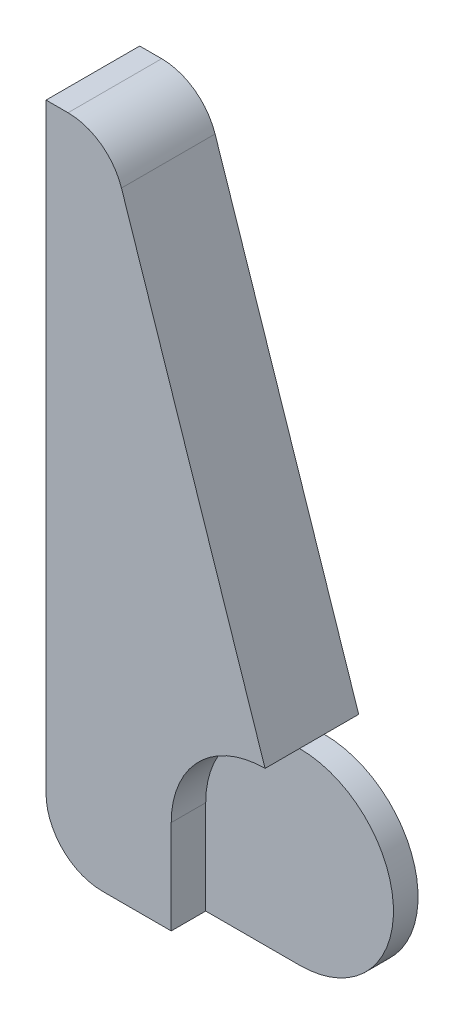
ISO-10303-21;
HEADER;
FILE_DESCRIPTION(('STEP AP214'),'2;1');
FILE_NAME('part.step','',(''),(''),'','','');
FILE_SCHEMA(('AUTOMOTIVE_DESIGN { 1 0 10303 214 1 1 1 1 }'));
ENDSEC;
DATA;
#1=APPLICATION_CONTEXT('core data for automotive mechanical design processes');
#2=APPLICATION_PROTOCOL_DEFINITION('international standard','automotive_design',2000,#1);
#3=PRODUCT_CONTEXT('',#1,'mechanical');
#4=PRODUCT('Part','Part','',(#3));
#5=PRODUCT_RELATED_PRODUCT_CATEGORY('part','',(#4));
#6=PRODUCT_DEFINITION_FORMATION('','',#4);
#7=PRODUCT_DEFINITION_CONTEXT('part definition',#1,'design');
#8=PRODUCT_DEFINITION('design','',#6,#7);
#9=PRODUCT_DEFINITION_SHAPE('','',#8);
#10=(LENGTH_UNIT() NAMED_UNIT(*) SI_UNIT(.MILLI.,.METRE.));
#11=(NAMED_UNIT(*) PLANE_ANGLE_UNIT() SI_UNIT($,.RADIAN.));
#12=(NAMED_UNIT(*) SI_UNIT($,.STERADIAN.) SOLID_ANGLE_UNIT());
#13=UNCERTAINTY_MEASURE_WITH_UNIT(LENGTH_MEASURE(1.E-05),#10,'distance_accuracy_value','');
#14=(GEOMETRIC_REPRESENTATION_CONTEXT(3) GLOBAL_UNCERTAINTY_ASSIGNED_CONTEXT((#13)) GLOBAL_UNIT_ASSIGNED_CONTEXT((#10,
#11,#12)) REPRESENTATION_CONTEXT('',''));
#15=CARTESIAN_POINT('',(0.,0.,0.));
#16=DIRECTION('',(0.,0.,1.));
#17=DIRECTION('',(1.,0.,0.));
#18=AXIS2_PLACEMENT_3D('',#15,#16,#17);
#19=CARTESIAN_POINT('',(0.,-38.1,-19.));
#20=DIRECTION('',(0.,-1.,0.));
#21=DIRECTION('',(1.,0.,0.));
#22=AXIS2_PLACEMENT_3D('',#19,#20,#21);
#23=PLANE('',#22);
#24=DIRECTION('',(1.,0.,0.));
#25=VECTOR('',#24,1.);
#26=CARTESIAN_POINT('',(0.,-38.1,-19.));
#27=LINE('',#26,#25);
#28=CARTESIAN_POINT('',(-66.04,-38.1,-19.));
#29=VERTEX_POINT('',#28);
#30=CARTESIAN_POINT('',(-38.1,-38.1,-19.));
#31=VERTEX_POINT('',#30);
#32=EDGE_CURVE('E141',#29,#31,#27,.T.);
#33=ORIENTED_EDGE('',*,*,#32,.T.);
#34=DIRECTION('',(0.,0.,-1.));
#35=VECTOR('',#34,1.);
#36=CARTESIAN_POINT('',(-38.1,-38.1,107.76307345283));
#37=LINE('',#36,#35);
#38=CARTESIAN_POINT('',(-38.1,-38.1,-5.));
#39=VERTEX_POINT('',#38);
#40=EDGE_CURVE('E49',#39,#31,#37,.T.);
#41=ORIENTED_EDGE('',*,*,#40,.F.);
#42=DIRECTION('',(1.,0.,0.));
#43=VECTOR('',#42,1.);
#44=CARTESIAN_POINT('',(-38.1,-38.1,-5.));
#45=LINE('',#44,#43);
#46=CARTESIAN_POINT('',(0.,-38.1,-5.));
#47=VERTEX_POINT('',#46);
#48=EDGE_CURVE('E124',#39,#47,#45,.T.);
#49=ORIENTED_EDGE('',*,*,#48,.T.);
#50=DIRECTION('',(0.,0.,1.));
#51=VECTOR('',#50,1.);
#52=CARTESIAN_POINT('',(0.,-38.1,-19.));
#53=LINE('',#52,#51);
#54=CARTESIAN_POINT('',(0.,-38.1,5.));
#55=VERTEX_POINT('',#54);
#56=EDGE_CURVE('E198',#47,#55,#53,.T.);
#57=ORIENTED_EDGE('',*,*,#56,.T.);
#58=DIRECTION('',(-1.,0.,0.));
#59=VECTOR('',#58,1.);
#60=CARTESIAN_POINT('',(-38.1,-38.1,5.));
#61=LINE('',#60,#59);
#62=CARTESIAN_POINT('',(-38.1,-38.1,5.));
#63=VERTEX_POINT('',#62);
#64=EDGE_CURVE('E147',#55,#63,#61,.T.);
#65=ORIENTED_EDGE('',*,*,#64,.T.);
#66=DIRECTION('',(0.,0.,1.));
#67=VECTOR('',#66,1.);
#68=CARTESIAN_POINT('',(-38.1,-38.1,-107.76307345283));
#69=LINE('',#68,#67);
#70=CARTESIAN_POINT('',(-38.1,-38.1,19.));
#71=VERTEX_POINT('',#70);
#72=EDGE_CURVE('E151',#63,#71,#69,.T.);
#73=ORIENTED_EDGE('',*,*,#72,.T.);
#74=DIRECTION('',(1.,0.,0.));
#75=VECTOR('',#74,1.);
#76=CARTESIAN_POINT('',(0.,-38.1,19.));
#77=LINE('',#76,#75);
#78=CARTESIAN_POINT('',(-66.04,-38.1,19.));
#79=VERTEX_POINT('',#78);
#80=EDGE_CURVE('E178',#79,#71,#77,.T.);
#81=ORIENTED_EDGE('',*,*,#80,.F.);
#82=DIRECTION('',(0.,0.,1.));
#83=VECTOR('',#82,1.);
#84=CARTESIAN_POINT('',(-66.04,-38.1,-19.));
#85=LINE('',#84,#83);
#86=EDGE_CURVE('E200',#29,#79,#85,.T.);
#87=ORIENTED_EDGE('',*,*,#86,.F.);
#88=EDGE_LOOP('',(#33,#41,#49,#57,#65,#73,#81,#87));
#89=FACE_BOUND('',#88,.T.);
#90=ADVANCED_FACE('F34',(#89),#23,.T.);
#91=CARTESIAN_POINT('',(0.,0.,-19.));
#92=DIRECTION('',(0.,0.,1.));
#93=DIRECTION('',(1.,0.,0.));
#94=AXIS2_PLACEMENT_3D('',#91,#92,#93);
#95=PLANE('',#94);
#96=CARTESIAN_POINT('',(0.,0.,-19.));
#97=DIRECTION('',(0.,0.,1.));
#98=DIRECTION('',(1.,0.,0.));
#99=AXIS2_PLACEMENT_3D('',#96,#97,#98);
#100=CIRCLE('',#99,38.1);
#101=CARTESIAN_POINT('',(-38.1,0.,-19.));
#102=VERTEX_POINT('',#101);
#103=CARTESIAN_POINT('',(0.,38.1,-19.));
#104=VERTEX_POINT('',#103);
#105=EDGE_CURVE('E12',#102,#104,#100,.F.);
#106=ORIENTED_EDGE('',*,*,#105,.F.);
#107=DIRECTION('',(0.,-1.,0.));
#108=VECTOR('',#107,1.);
#109=CARTESIAN_POINT('',(-38.1,0.,-19.));
#110=LINE('',#109,#108);
#111=EDGE_CURVE('E142',#102,#31,#110,.T.);
#112=ORIENTED_EDGE('',*,*,#111,.T.);
#113=ORIENTED_EDGE('',*,*,#32,.F.);
#114=CARTESIAN_POINT('',(-66.04,-15.24,-19.));
#115=DIRECTION('',(0.,0.,1.));
#116=DIRECTION('',(-1.,0.,0.));
#117=AXIS2_PLACEMENT_3D('',#114,#115,#116);
#118=CIRCLE('',#117,22.86);
#119=CARTESIAN_POINT('',(-88.9,-15.24,-19.));
#120=VERTEX_POINT('',#119);
#121=EDGE_CURVE('E193',#120,#29,#118,.T.);
#122=ORIENTED_EDGE('',*,*,#121,.F.);
#123=DIRECTION('',(0.,-1.,0.));
#124=VECTOR('',#123,1.);
#125=CARTESIAN_POINT('',(-88.9,-15.24,-19.));
#126=LINE('',#125,#124);
#127=CARTESIAN_POINT('',(-88.9,228.6,-19.));
#128=VERTEX_POINT('',#127);
#129=EDGE_CURVE('E190',#128,#120,#126,.T.);
#130=ORIENTED_EDGE('',*,*,#129,.F.);
#131=DIRECTION('',(-1.,0.,0.));
#132=VECTOR('',#131,1.);
#133=CARTESIAN_POINT('',(-88.9,228.6,-19.));
#134=LINE('',#133,#132);
#135=CARTESIAN_POINT('',(-79.9765557704831,228.6,-19.));
#136=VERTEX_POINT('',#135);
#137=EDGE_CURVE('E187',#136,#128,#134,.T.);
#138=ORIENTED_EDGE('',*,*,#137,.F.);
#139=CARTESIAN_POINT('',(-79.9765557704831,205.74,-19.));
#140=DIRECTION('',(0.,0.,1.));
#141=DIRECTION('',(-1.,0.,0.));
#142=AXIS2_PLACEMENT_3D('',#139,#140,#141);
#143=CIRCLE('',#142,22.86);
#144=CARTESIAN_POINT('',(-58.2896555770483,212.968966731145,-19.));
#145=VERTEX_POINT('',#144);
#146=EDGE_CURVE('E184',#145,#136,#143,.T.);
#147=ORIENTED_EDGE('',*,*,#146,.F.);
#148=DIRECTION('',(-0.316227766016838,0.948683298050514,0.));
#149=VECTOR('',#148,1.);
#150=CARTESIAN_POINT('',(-58.2896555770483,212.968966731145,-19.));
#151=LINE('',#150,#149);
#152=EDGE_CURVE('E181',#104,#145,#151,.T.);
#153=ORIENTED_EDGE('',*,*,#152,.F.);
#154=EDGE_LOOP('',(#106,#112,#113,#122,#130,#138,#147,#153));
#155=FACE_BOUND('',#154,.T.);
#156=ADVANCED_FACE('F245',(#155),#95,.F.);
#157=CARTESIAN_POINT('',(0.,0.,-19.));
#158=DIRECTION('',(0.,0.,1.));
#159=DIRECTION('',(1.,0.,0.));
#160=AXIS2_PLACEMENT_3D('',#157,#158,#159);
#161=CYLINDRICAL_SURFACE('',#160,38.1);
#162=CARTESIAN_POINT('',(0.,0.,-5.));
#163=DIRECTION('',(0.,0.,1.));
#164=DIRECTION('',(1.,0.,0.));
#165=AXIS2_PLACEMENT_3D('',#162,#163,#164);
#166=CIRCLE('',#165,38.1);
#167=CARTESIAN_POINT('',(0.,38.1,-5.));
#168=VERTEX_POINT('',#167);
#169=EDGE_CURVE('E130',#47,#168,#166,.T.);
#170=ORIENTED_EDGE('',*,*,#169,.T.);
#171=DIRECTION('',(0.,0.,1.));
#172=VECTOR('',#171,1.);
#173=CARTESIAN_POINT('',(0.,38.1,-19.));
#174=LINE('',#173,#172);
#175=CARTESIAN_POINT('',(0.,38.1,5.));
#176=VERTEX_POINT('',#175);
#177=EDGE_CURVE('E197',#168,#176,#174,.T.);
#178=ORIENTED_EDGE('',*,*,#177,.T.);
#179=CARTESIAN_POINT('',(0.,0.,5.));
#180=DIRECTION('',(0.,0.,1.));
#181=DIRECTION('',(1.,0.,0.));
#182=AXIS2_PLACEMENT_3D('',#179,#180,#181);
#183=CIRCLE('',#182,38.1);
#184=EDGE_CURVE('E150',#176,#55,#183,.F.);
#185=ORIENTED_EDGE('',*,*,#184,.T.);
#186=ORIENTED_EDGE('',*,*,#56,.F.);
#187=EDGE_LOOP('',(#170,#178,#185,#186));
#188=FACE_BOUND('',#187,.T.);
#189=ADVANCED_FACE('F36',(#188),#161,.T.);
#190=CARTESIAN_POINT('',(-66.04,-15.24,-19.));
#191=DIRECTION('',(0.,0.,1.));
#192=DIRECTION('',(1.,0.,0.));
#193=AXIS2_PLACEMENT_3D('',#190,#191,#192);
#194=CYLINDRICAL_SURFACE('',#193,22.86);
#195=ORIENTED_EDGE('',*,*,#86,.T.);
#196=CARTESIAN_POINT('',(-66.04,-15.24,19.));
#197=DIRECTION('',(0.,0.,1.));
#198=DIRECTION('',(-1.,0.,0.));
#199=AXIS2_PLACEMENT_3D('',#196,#197,#198);
#200=CIRCLE('',#199,22.86);
#201=CARTESIAN_POINT('',(-88.9,-15.24,19.));
#202=VERTEX_POINT('',#201);
#203=EDGE_CURVE('E175',#202,#79,#200,.T.);
#204=ORIENTED_EDGE('',*,*,#203,.F.);
#205=DIRECTION('',(0.,0.,1.));
#206=VECTOR('',#205,1.);
#207=CARTESIAN_POINT('',(-88.9,-15.24,-19.));
#208=LINE('',#207,#206);
#209=EDGE_CURVE('E202',#120,#202,#208,.T.);
#210=ORIENTED_EDGE('',*,*,#209,.F.);
#211=ORIENTED_EDGE('',*,*,#121,.T.);
#212=EDGE_LOOP('',(#195,#204,#210,#211));
#213=FACE_BOUND('',#212,.T.);
#214=ADVANCED_FACE('F252',(#213),#194,.T.);
#215=CARTESIAN_POINT('',(-88.9,-15.24,-19.));
#216=DIRECTION('',(-1.,0.,0.));
#217=DIRECTION('',(0.,0.,1.));
#218=AXIS2_PLACEMENT_3D('',#215,#216,#217);
#219=PLANE('',#218);
#220=ORIENTED_EDGE('',*,*,#209,.T.);
#221=DIRECTION('',(0.,-1.,0.));
#222=VECTOR('',#221,1.);
#223=CARTESIAN_POINT('',(-88.9,-15.24,19.));
#224=LINE('',#223,#222);
#225=CARTESIAN_POINT('',(-88.9,228.6,19.));
#226=VERTEX_POINT('',#225);
#227=EDGE_CURVE('E172',#226,#202,#224,.T.);
#228=ORIENTED_EDGE('',*,*,#227,.F.);
#229=DIRECTION('',(0.,0.,1.));
#230=VECTOR('',#229,1.);
#231=CARTESIAN_POINT('',(-88.9,228.6,-19.));
#232=LINE('',#231,#230);
#233=EDGE_CURVE('E204',#128,#226,#232,.T.);
#234=ORIENTED_EDGE('',*,*,#233,.F.);
#235=ORIENTED_EDGE('',*,*,#129,.T.);
#236=EDGE_LOOP('',(#220,#228,#234,#235));
#237=FACE_BOUND('',#236,.T.);
#238=ADVANCED_FACE('F248',(#237),#219,.T.);
#239=CARTESIAN_POINT('',(-88.9,228.6,-19.));
#240=DIRECTION('',(0.,1.,0.));
#241=DIRECTION('',(0.,0.,1.));
#242=AXIS2_PLACEMENT_3D('',#239,#240,#241);
#243=PLANE('',#242);
#244=ORIENTED_EDGE('',*,*,#233,.T.);
#245=DIRECTION('',(-1.,0.,0.));
#246=VECTOR('',#245,1.);
#247=CARTESIAN_POINT('',(-88.9,228.6,19.));
#248=LINE('',#247,#246);
#249=CARTESIAN_POINT('',(-79.9765557704831,228.6,19.));
#250=VERTEX_POINT('',#249);
#251=EDGE_CURVE('E169',#250,#226,#248,.T.);
#252=ORIENTED_EDGE('',*,*,#251,.F.);
#253=DIRECTION('',(0.,0.,1.));
#254=VECTOR('',#253,1.);
#255=CARTESIAN_POINT('',(-79.9765557704831,228.6,-19.));
#256=LINE('',#255,#254);
#257=EDGE_CURVE('E206',#136,#250,#256,.T.);
#258=ORIENTED_EDGE('',*,*,#257,.F.);
#259=ORIENTED_EDGE('',*,*,#137,.T.);
#260=EDGE_LOOP('',(#244,#252,#258,#259));
#261=FACE_BOUND('',#260,.T.);
#262=ADVANCED_FACE('F241',(#261),#243,.T.);
#263=CARTESIAN_POINT('',(-79.9765557704831,205.74,-19.));
#264=DIRECTION('',(0.,0.,1.));
#265=DIRECTION('',(1.,0.,0.));
#266=AXIS2_PLACEMENT_3D('',#263,#264,#265);
#267=CYLINDRICAL_SURFACE('',#266,22.86);
#268=ORIENTED_EDGE('',*,*,#257,.T.);
#269=CARTESIAN_POINT('',(-79.9765557704831,205.74,19.));
#270=DIRECTION('',(0.,0.,1.));
#271=DIRECTION('',(-1.,0.,0.));
#272=AXIS2_PLACEMENT_3D('',#269,#270,#271);
#273=CIRCLE('',#272,22.86);
#274=CARTESIAN_POINT('',(-58.2896555770483,212.968966731145,19.));
#275=VERTEX_POINT('',#274);
#276=EDGE_CURVE('E166',#275,#250,#273,.T.);
#277=ORIENTED_EDGE('',*,*,#276,.F.);
#278=DIRECTION('',(0.,0.,1.));
#279=VECTOR('',#278,1.);
#280=CARTESIAN_POINT('',(-58.2896555770483,212.968966731145,-19.));
#281=LINE('',#280,#279);
#282=EDGE_CURVE('E208',#145,#275,#281,.T.);
#283=ORIENTED_EDGE('',*,*,#282,.F.);
#284=ORIENTED_EDGE('',*,*,#146,.T.);
#285=EDGE_LOOP('',(#268,#277,#283,#284));
#286=FACE_BOUND('',#285,.T.);
#287=ADVANCED_FACE('F237',(#286),#267,.T.);
#288=CARTESIAN_POINT('',(-58.2896555770483,212.968966731145,-19.));
#289=DIRECTION('',(0.948683298050514,0.316227766016838,0.));
#290=DIRECTION('',(-0.316227766016838,0.948683298050514,0.));
#291=AXIS2_PLACEMENT_3D('',#288,#289,#290);
#292=PLANE('',#291);
#293=ORIENTED_EDGE('',*,*,#282,.T.);
#294=DIRECTION('',(-0.316227766016838,0.948683298050514,0.));
#295=VECTOR('',#294,1.);
#296=CARTESIAN_POINT('',(-58.2896555770483,212.968966731145,19.));
#297=LINE('',#296,#295);
#298=CARTESIAN_POINT('',(0.,38.1,19.));
#299=VERTEX_POINT('',#298);
#300=EDGE_CURVE('E163',#299,#275,#297,.T.);
#301=ORIENTED_EDGE('',*,*,#300,.F.);
#302=DIRECTION('',(0.,0.,1.));
#303=VECTOR('',#302,1.);
#304=CARTESIAN_POINT('',(0.,38.1,-107.76307345283));
#305=LINE('',#304,#303);
#306=EDGE_CURVE('E161',#176,#299,#305,.T.);
#307=ORIENTED_EDGE('',*,*,#306,.F.);
#308=ORIENTED_EDGE('',*,*,#177,.F.);
#309=EDGE_CURVE('E210',#104,#168,#174,.T.);
#310=ORIENTED_EDGE('',*,*,#309,.F.);
#311=ORIENTED_EDGE('',*,*,#152,.T.);
#312=EDGE_LOOP('',(#293,#301,#307,#308,#310,#311));
#313=FACE_BOUND('',#312,.T.);
#314=ADVANCED_FACE('F232',(#313),#292,.T.);
#315=CARTESIAN_POINT('',(0.,0.,19.));
#316=DIRECTION('',(0.,0.,1.));
#317=DIRECTION('',(1.,0.,0.));
#318=AXIS2_PLACEMENT_3D('',#315,#316,#317);
#319=PLANE('',#318);
#320=CARTESIAN_POINT('',(0.,0.,19.));
#321=DIRECTION('',(0.,0.,1.));
#322=DIRECTION('',(1.,0.,0.));
#323=AXIS2_PLACEMENT_3D('',#320,#321,#322);
#324=CIRCLE('',#323,38.1);
#325=CARTESIAN_POINT('',(-38.1,0.,19.));
#326=VERTEX_POINT('',#325);
#327=EDGE_CURVE('E42',#299,#326,#324,.T.);
#328=ORIENTED_EDGE('',*,*,#327,.F.);
#329=ORIENTED_EDGE('',*,*,#300,.T.);
#330=ORIENTED_EDGE('',*,*,#276,.T.);
#331=ORIENTED_EDGE('',*,*,#251,.T.);
#332=ORIENTED_EDGE('',*,*,#227,.T.);
#333=ORIENTED_EDGE('',*,*,#203,.T.);
#334=ORIENTED_EDGE('',*,*,#80,.T.);
#335=DIRECTION('',(0.,-1.,0.));
#336=VECTOR('',#335,1.);
#337=CARTESIAN_POINT('',(-38.1,0.,19.));
#338=LINE('',#337,#336);
#339=EDGE_CURVE('E137',#326,#71,#338,.T.);
#340=ORIENTED_EDGE('',*,*,#339,.F.);
#341=EDGE_LOOP('',(#328,#329,#330,#331,#332,#333,#334,#340));
#342=FACE_BOUND('',#341,.T.);
#343=ADVANCED_FACE('F218',(#342),#319,.T.);
#344=CARTESIAN_POINT('',(0.,0.,-107.76307345283));
#345=DIRECTION('',(0.,0.,1.));
#346=DIRECTION('',(1.,0.,0.));
#347=AXIS2_PLACEMENT_3D('',#344,#345,#346);
#348=CYLINDRICAL_SURFACE('',#347,38.1);
#349=ORIENTED_EDGE('',*,*,#306,.T.);
#350=ORIENTED_EDGE('',*,*,#327,.T.);
#351=DIRECTION('',(0.,0.,1.));
#352=VECTOR('',#351,1.);
#353=CARTESIAN_POINT('',(-38.1,0.,-107.76307345283));
#354=LINE('',#353,#352);
#355=CARTESIAN_POINT('',(-38.1,0.,5.));
#356=VERTEX_POINT('',#355);
#357=EDGE_CURVE('E57',#356,#326,#354,.T.);
#358=ORIENTED_EDGE('',*,*,#357,.F.);
#359=EDGE_CURVE('E152',#356,#176,#183,.F.);
#360=ORIENTED_EDGE('',*,*,#359,.T.);
#361=EDGE_LOOP('',(#349,#350,#358,#360));
#362=FACE_BOUND('',#361,.T.);
#363=ADVANCED_FACE('F214',(#362),#348,.F.);
#364=CARTESIAN_POINT('',(-38.1,0.,-107.76307345283));
#365=DIRECTION('',(-1.,0.,0.));
#366=DIRECTION('',(0.,-1.,0.));
#367=AXIS2_PLACEMENT_3D('',#364,#365,#366);
#368=PLANE('',#367);
#369=DIRECTION('',(0.,1.,0.));
#370=VECTOR('',#369,1.);
#371=CARTESIAN_POINT('',(-38.1,0.,5.));
#372=LINE('',#371,#370);
#373=EDGE_CURVE('E155',#63,#356,#372,.T.);
#374=ORIENTED_EDGE('',*,*,#373,.T.);
#375=ORIENTED_EDGE('',*,*,#357,.T.);
#376=ORIENTED_EDGE('',*,*,#339,.T.);
#377=ORIENTED_EDGE('',*,*,#72,.F.);
#378=EDGE_LOOP('',(#374,#375,#376,#377));
#379=FACE_BOUND('',#378,.T.);
#380=ADVANCED_FACE('F220',(#379),#368,.F.);
#381=CARTESIAN_POINT('',(0.,0.,5.));
#382=DIRECTION('',(0.,0.,1.));
#383=DIRECTION('',(1.,0.,0.));
#384=AXIS2_PLACEMENT_3D('',#381,#382,#383);
#385=PLANE('',#384);
#386=ORIENTED_EDGE('',*,*,#359,.F.);
#387=ORIENTED_EDGE('',*,*,#373,.F.);
#388=ORIENTED_EDGE('',*,*,#64,.F.);
#389=ORIENTED_EDGE('',*,*,#184,.F.);
#390=EDGE_LOOP('',(#386,#387,#388,#389));
#391=FACE_BOUND('',#390,.T.);
#392=ADVANCED_FACE('F227',(#391),#385,.T.);
#393=CARTESIAN_POINT('',(0.,0.,107.76307345283));
#394=DIRECTION('',(0.,0.,-1.));
#395=DIRECTION('',(-1.,0.,0.));
#396=AXIS2_PLACEMENT_3D('',#393,#394,#395);
#397=CYLINDRICAL_SURFACE('',#396,38.1);
#398=CARTESIAN_POINT('',(-38.1,0.,-5.));
#399=VERTEX_POINT('',#398);
#400=EDGE_CURVE('E133',#168,#399,#166,.T.);
#401=ORIENTED_EDGE('',*,*,#400,.T.);
#402=DIRECTION('',(0.,0.,-1.));
#403=VECTOR('',#402,1.);
#404=CARTESIAN_POINT('',(-38.1,0.,107.76307345283));
#405=LINE('',#404,#403);
#406=EDGE_CURVE('E136',#399,#102,#405,.T.);
#407=ORIENTED_EDGE('',*,*,#406,.T.);
#408=ORIENTED_EDGE('',*,*,#105,.T.);
#409=ORIENTED_EDGE('',*,*,#309,.T.);
#410=EDGE_LOOP('',(#401,#407,#408,#409));
#411=FACE_BOUND('',#410,.T.);
#412=ADVANCED_FACE('F254',(#411),#397,.F.);
#413=CARTESIAN_POINT('',(-38.1,0.,107.76307345283));
#414=DIRECTION('',(1.,0.,0.));
#415=DIRECTION('',(0.,1.,0.));
#416=AXIS2_PLACEMENT_3D('',#413,#414,#415);
#417=PLANE('',#416);
#418=DIRECTION('',(0.,-1.,0.));
#419=VECTOR('',#418,1.);
#420=CARTESIAN_POINT('',(-38.1,0.,-5.));
#421=LINE('',#420,#419);
#422=EDGE_CURVE('E127',#399,#39,#421,.T.);
#423=ORIENTED_EDGE('',*,*,#422,.T.);
#424=ORIENTED_EDGE('',*,*,#40,.T.);
#425=ORIENTED_EDGE('',*,*,#111,.F.);
#426=ORIENTED_EDGE('',*,*,#406,.F.);
#427=EDGE_LOOP('',(#423,#424,#425,#426));
#428=FACE_BOUND('',#427,.T.);
#429=ADVANCED_FACE('F135',(#428),#417,.T.);
#430=CARTESIAN_POINT('',(0.,0.,-5.));
#431=DIRECTION('',(0.,0.,1.));
#432=DIRECTION('',(1.,0.,0.));
#433=AXIS2_PLACEMENT_3D('',#430,#431,#432);
#434=PLANE('',#433);
#435=ORIENTED_EDGE('',*,*,#48,.F.);
#436=ORIENTED_EDGE('',*,*,#422,.F.);
#437=ORIENTED_EDGE('',*,*,#400,.F.);
#438=ORIENTED_EDGE('',*,*,#169,.F.);
#439=EDGE_LOOP('',(#435,#436,#437,#438));
#440=FACE_BOUND('',#439,.T.);
#441=ADVANCED_FACE('F125',(#440),#434,.F.);
#442=CLOSED_SHELL('',(#90,#156,#189,#214,#238,#262,#287,#314,#343,#363,#380,#392,#412,#429,#441));
#443=MANIFOLD_SOLID_BREP('B2',#442);
#444=ADVANCED_BREP_SHAPE_REPRESENTATION('',(#18,#443),#14);
#445=SHAPE_DEFINITION_REPRESENTATION(#9,#444);
ENDSEC;
END-ISO-10303-21;
